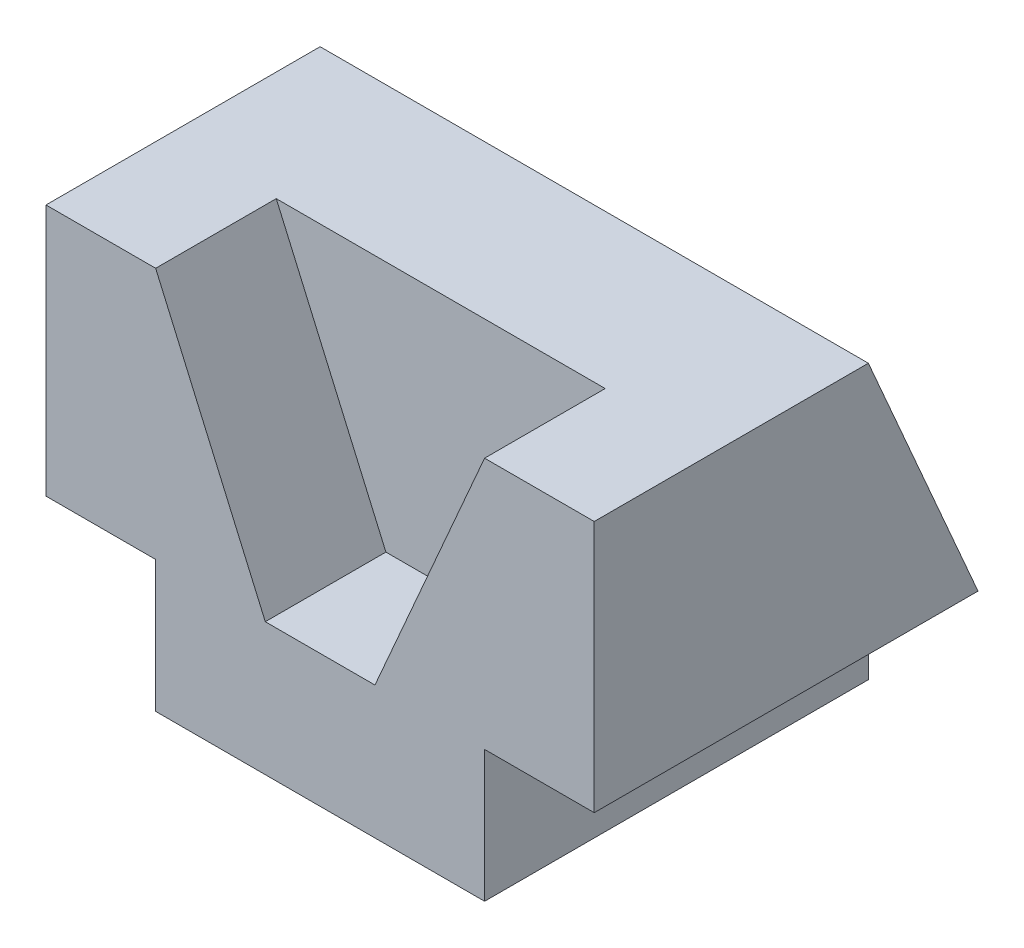
ISO-10303-21;
HEADER;
FILE_DESCRIPTION(('STEP AP214'),'2;1');
FILE_NAME('part.step','',(''),(''),'','','');
FILE_SCHEMA(('AUTOMOTIVE_DESIGN { 1 0 10303 214 1 1 1 1 }'));
ENDSEC;
DATA;
#1=APPLICATION_CONTEXT('core data for automotive mechanical design processes');
#2=APPLICATION_PROTOCOL_DEFINITION('international standard','automotive_design',2000,#1);
#3=PRODUCT_CONTEXT('',#1,'mechanical');
#4=PRODUCT('Part','Part','',(#3));
#5=PRODUCT_RELATED_PRODUCT_CATEGORY('part','',(#4));
#6=PRODUCT_DEFINITION_FORMATION('','',#4);
#7=PRODUCT_DEFINITION_CONTEXT('part definition',#1,'design');
#8=PRODUCT_DEFINITION('design','',#6,#7);
#9=PRODUCT_DEFINITION_SHAPE('','',#8);
#10=(LENGTH_UNIT() NAMED_UNIT(*) SI_UNIT(.MILLI.,.METRE.));
#11=(NAMED_UNIT(*) PLANE_ANGLE_UNIT() SI_UNIT($,.RADIAN.));
#12=(NAMED_UNIT(*) SI_UNIT($,.STERADIAN.) SOLID_ANGLE_UNIT());
#13=UNCERTAINTY_MEASURE_WITH_UNIT(LENGTH_MEASURE(1.E-05),#10,'distance_accuracy_value','');
#14=(GEOMETRIC_REPRESENTATION_CONTEXT(3) GLOBAL_UNCERTAINTY_ASSIGNED_CONTEXT((#13)) GLOBAL_UNIT_ASSIGNED_CONTEXT((#10,
#11,#12)) REPRESENTATION_CONTEXT('',''));
#15=CARTESIAN_POINT('',(0.,0.,0.));
#16=DIRECTION('',(0.,0.,1.));
#17=DIRECTION('',(1.,0.,0.));
#18=AXIS2_PLACEMENT_3D('',#15,#16,#17);
#19=CARTESIAN_POINT('',(-15000.,12000.,35000.));
#20=DIRECTION('',(1.,0.,0.));
#21=DIRECTION('',(0.,1.,0.));
#22=AXIS2_PLACEMENT_3D('',#19,#20,#21);
#23=PLANE('',#22);
#24=DIRECTION('',(0.,-1.,0.));
#25=VECTOR('',#24,1.);
#26=CARTESIAN_POINT('',(-15000.,12000.,0.));
#27=LINE('',#26,#25);
#28=CARTESIAN_POINT('',(-15000.,12000.,0.));
#29=VERTEX_POINT('',#28);
#30=CARTESIAN_POINT('',(-15000.,0.,0.));
#31=VERTEX_POINT('',#30);
#32=EDGE_CURVE('E133',#29,#31,#27,.T.);
#33=ORIENTED_EDGE('',*,*,#32,.T.);
#34=DIRECTION('',(0.,0.,-1.));
#35=VECTOR('',#34,1.);
#36=CARTESIAN_POINT('',(-15000.,0.,35000.));
#37=LINE('',#36,#35);
#38=CARTESIAN_POINT('',(-15000.,0.,35000.));
#39=VERTEX_POINT('',#38);
#40=EDGE_CURVE('E40',#39,#31,#37,.T.);
#41=ORIENTED_EDGE('',*,*,#40,.F.);
#42=DIRECTION('',(0.,-1.,0.));
#43=VECTOR('',#42,1.);
#44=CARTESIAN_POINT('',(-15000.,12000.,35000.));
#45=LINE('',#44,#43);
#46=CARTESIAN_POINT('',(-15000.,12000.,35000.));
#47=VERTEX_POINT('',#46);
#48=EDGE_CURVE('E147',#47,#39,#45,.T.);
#49=ORIENTED_EDGE('',*,*,#48,.F.);
#50=DIRECTION('',(0.,0.,-1.));
#51=VECTOR('',#50,1.);
#52=CARTESIAN_POINT('',(-15000.,12000.,35000.));
#53=LINE('',#52,#51);
#54=EDGE_CURVE('E128',#47,#29,#53,.T.);
#55=ORIENTED_EDGE('',*,*,#54,.T.);
#56=EDGE_LOOP('',(#33,#41,#49,#55));
#57=FACE_BOUND('',#56,.T.);
#58=ADVANCED_FACE('F33',(#57),#23,.F.);
#59=CARTESIAN_POINT('',(-15000.,0.,35000.));
#60=DIRECTION('',(0.,1.,0.));
#61=DIRECTION('',(-1.,0.,0.));
#62=AXIS2_PLACEMENT_3D('',#59,#60,#61);
#63=PLANE('',#62);
#64=DIRECTION('',(1.,0.,0.));
#65=VECTOR('',#64,1.);
#66=CARTESIAN_POINT('',(-15000.,0.,0.));
#67=LINE('',#66,#65);
#68=CARTESIAN_POINT('',(15000.,9.18485099360515E-12,0.));
#69=VERTEX_POINT('',#68);
#70=EDGE_CURVE('E136',#31,#69,#67,.T.);
#71=ORIENTED_EDGE('',*,*,#70,.T.);
#72=DIRECTION('',(0.,0.,-1.));
#73=VECTOR('',#72,1.);
#74=CARTESIAN_POINT('',(15000.,9.18485099360515E-12,35000.));
#75=LINE('',#74,#73);
#76=CARTESIAN_POINT('',(15000.,9.18485099360515E-12,35000.));
#77=VERTEX_POINT('',#76);
#78=EDGE_CURVE('E158',#77,#69,#75,.T.);
#79=ORIENTED_EDGE('',*,*,#78,.F.);
#80=DIRECTION('',(1.,0.,0.));
#81=VECTOR('',#80,1.);
#82=CARTESIAN_POINT('',(-15000.,0.,35000.));
#83=LINE('',#82,#81);
#84=EDGE_CURVE('E84',#39,#77,#83,.T.);
#85=ORIENTED_EDGE('',*,*,#84,.F.);
#86=ORIENTED_EDGE('',*,*,#40,.T.);
#87=EDGE_LOOP('',(#71,#79,#85,#86));
#88=FACE_BOUND('',#87,.T.);
#89=ADVANCED_FACE('F161',(#88),#63,.F.);
#90=CARTESIAN_POINT('',(15000.,9.18485099360515E-12,35000.));
#91=DIRECTION('',(-1.,0.,0.));
#92=DIRECTION('',(0.,0.,1.));
#93=AXIS2_PLACEMENT_3D('',#90,#91,#92);
#94=PLANE('',#93);
#95=DIRECTION('',(0.,1.,0.));
#96=VECTOR('',#95,1.);
#97=CARTESIAN_POINT('',(15000.,9.18485099360515E-12,0.));
#98=LINE('',#97,#96);
#99=CARTESIAN_POINT('',(15000.,12000.,0.));
#100=VERTEX_POINT('',#99);
#101=EDGE_CURVE('E139',#69,#100,#98,.T.);
#102=ORIENTED_EDGE('',*,*,#101,.T.);
#103=DIRECTION('',(0.,0.,-1.));
#104=VECTOR('',#103,1.);
#105=CARTESIAN_POINT('',(15000.,12000.,35000.));
#106=LINE('',#105,#104);
#107=CARTESIAN_POINT('',(15000.,12000.,35000.));
#108=VERTEX_POINT('',#107);
#109=EDGE_CURVE('E155',#108,#100,#106,.T.);
#110=ORIENTED_EDGE('',*,*,#109,.F.);
#111=DIRECTION('',(0.,1.,0.));
#112=VECTOR('',#111,1.);
#113=CARTESIAN_POINT('',(15000.,9.18485099360515E-12,35000.));
#114=LINE('',#113,#112);
#115=EDGE_CURVE('E224',#77,#108,#114,.T.);
#116=ORIENTED_EDGE('',*,*,#115,.F.);
#117=ORIENTED_EDGE('',*,*,#78,.T.);
#118=EDGE_LOOP('',(#102,#110,#116,#117));
#119=FACE_BOUND('',#118,.T.);
#120=ADVANCED_FACE('F233',(#119),#94,.F.);
#121=CARTESIAN_POINT('',(15000.,12000.,35000.));
#122=DIRECTION('',(0.,1.,0.));
#123=DIRECTION('',(0.,0.,1.));
#124=AXIS2_PLACEMENT_3D('',#121,#122,#123);
#125=PLANE('',#124);
#126=DIRECTION('',(1.,0.,0.));
#127=VECTOR('',#126,1.);
#128=CARTESIAN_POINT('',(15000.,12000.,0.));
#129=LINE('',#128,#127);
#130=CARTESIAN_POINT('',(25000.,12000.,0.));
#131=VERTEX_POINT('',#130);
#132=EDGE_CURVE('E142',#100,#131,#129,.T.);
#133=ORIENTED_EDGE('',*,*,#132,.T.);
#134=DIRECTION('',(0.,0.,-1.));
#135=VECTOR('',#134,1.);
#136=CARTESIAN_POINT('',(25000.,12000.,35000.));
#137=LINE('',#136,#135);
#138=CARTESIAN_POINT('',(25000.,12000.,35000.));
#139=VERTEX_POINT('',#138);
#140=EDGE_CURVE('E152',#139,#131,#137,.T.);
#141=ORIENTED_EDGE('',*,*,#140,.F.);
#142=DIRECTION('',(1.,0.,0.));
#143=VECTOR('',#142,1.);
#144=CARTESIAN_POINT('',(15000.,12000.,35000.));
#145=LINE('',#144,#143);
#146=EDGE_CURVE('E210',#108,#139,#145,.T.);
#147=ORIENTED_EDGE('',*,*,#146,.F.);
#148=ORIENTED_EDGE('',*,*,#109,.T.);
#149=EDGE_LOOP('',(#133,#141,#147,#148));
#150=FACE_BOUND('',#149,.T.);
#151=ADVANCED_FACE('F235',(#150),#125,.F.);
#152=CARTESIAN_POINT('',(25000.,12000.,35000.));
#153=DIRECTION('',(-1.,0.,0.));
#154=DIRECTION('',(0.,-1.,0.));
#155=AXIS2_PLACEMENT_3D('',#152,#153,#154);
#156=PLANE('',#155);
#157=ORIENTED_EDGE('',*,*,#140,.T.);
#158=DIRECTION('',(0.,0.917070056253235,0.39872611141445));
#159=VECTOR('',#158,1.);
#160=CARTESIAN_POINT('',(25000.,1907.79014308427,-4387.9173290938));
#161=LINE('',#160,#159);
#162=CARTESIAN_POINT('',(25000.,35000.,10000.));
#163=VERTEX_POINT('',#162);
#164=EDGE_CURVE('E75',#131,#163,#161,.T.);
#165=ORIENTED_EDGE('',*,*,#164,.T.);
#166=DIRECTION('',(0.,0.,-1.));
#167=VECTOR('',#166,1.);
#168=CARTESIAN_POINT('',(25000.,35000.,35000.));
#169=LINE('',#168,#167);
#170=CARTESIAN_POINT('',(25000.,35000.,35000.));
#171=VERTEX_POINT('',#170);
#172=EDGE_CURVE('E122',#171,#163,#169,.T.);
#173=ORIENTED_EDGE('',*,*,#172,.F.);
#174=DIRECTION('',(0.,1.,0.));
#175=VECTOR('',#174,1.);
#176=CARTESIAN_POINT('',(25000.,12000.,35000.));
#177=LINE('',#176,#175);
#178=EDGE_CURVE('E111',#139,#171,#177,.T.);
#179=ORIENTED_EDGE('',*,*,#178,.F.);
#180=EDGE_LOOP('',(#157,#165,#173,#179));
#181=FACE_BOUND('',#180,.T.);
#182=ADVANCED_FACE('F213',(#181),#156,.F.);
#183=CARTESIAN_POINT('',(25000.,35000.,35000.));
#184=DIRECTION('',(0.,-1.,0.));
#185=DIRECTION('',(1.,0.,0.));
#186=AXIS2_PLACEMENT_3D('',#183,#184,#185);
#187=PLANE('',#186);
#188=ORIENTED_EDGE('',*,*,#172,.T.);
#189=DIRECTION('',(-1.,0.,0.));
#190=VECTOR('',#189,1.);
#191=CARTESIAN_POINT('',(25000.,35000.,10000.));
#192=LINE('',#191,#190);
#193=CARTESIAN_POINT('',(-25000.,35000.,10000.));
#194=VERTEX_POINT('',#193);
#195=EDGE_CURVE('E119',#163,#194,#192,.T.);
#196=ORIENTED_EDGE('',*,*,#195,.T.);
#197=DIRECTION('',(0.,0.,-1.));
#198=VECTOR('',#197,1.);
#199=CARTESIAN_POINT('',(-25000.,35000.,35000.));
#200=LINE('',#199,#198);
#201=CARTESIAN_POINT('',(-25000.,35000.,35000.));
#202=VERTEX_POINT('',#201);
#203=EDGE_CURVE('E115',#202,#194,#200,.T.);
#204=ORIENTED_EDGE('',*,*,#203,.F.);
#205=DIRECTION('',(-1.,0.,0.));
#206=VECTOR('',#205,1.);
#207=CARTESIAN_POINT('',(25000.,35000.,35000.));
#208=LINE('',#207,#206);
#209=CARTESIAN_POINT('',(-15000.,35000.,35000.));
#210=VERTEX_POINT('',#209);
#211=EDGE_CURVE('E100',#210,#202,#208,.T.);
#212=ORIENTED_EDGE('',*,*,#211,.F.);
#213=DIRECTION('',(0.,0.,1.));
#214=VECTOR('',#213,1.);
#215=CARTESIAN_POINT('',(-15000.,35000.,24000.));
#216=LINE('',#215,#214);
#217=CARTESIAN_POINT('',(-15000.,35000.,24000.));
#218=VERTEX_POINT('',#217);
#219=EDGE_CURVE('E47',#218,#210,#216,.T.);
#220=ORIENTED_EDGE('',*,*,#219,.F.);
#221=DIRECTION('',(-1.,0.,0.));
#222=VECTOR('',#221,1.);
#223=CARTESIAN_POINT('',(-15000.,35000.,24000.));
#224=LINE('',#223,#222);
#225=CARTESIAN_POINT('',(15000.,35000.,24000.));
#226=VERTEX_POINT('',#225);
#227=EDGE_CURVE('E200',#226,#218,#224,.T.);
#228=ORIENTED_EDGE('',*,*,#227,.F.);
#229=DIRECTION('',(0.,0.,1.));
#230=VECTOR('',#229,1.);
#231=CARTESIAN_POINT('',(15000.,35000.,24000.));
#232=LINE('',#231,#230);
#233=CARTESIAN_POINT('',(15000.,35000.,35000.));
#234=VERTEX_POINT('',#233);
#235=EDGE_CURVE('E137',#226,#234,#232,.T.);
#236=ORIENTED_EDGE('',*,*,#235,.T.);
#237=EDGE_CURVE('E110',#171,#234,#208,.T.);
#238=ORIENTED_EDGE('',*,*,#237,.F.);
#239=EDGE_LOOP('',(#188,#196,#204,#212,#220,#228,#236,#238));
#240=FACE_BOUND('',#239,.T.);
#241=ADVANCED_FACE('F117',(#240),#187,.F.);
#242=CARTESIAN_POINT('',(-25000.,35000.,35000.));
#243=DIRECTION('',(1.,0.,0.));
#244=DIRECTION('',(0.,1.,0.));
#245=AXIS2_PLACEMENT_3D('',#242,#243,#244);
#246=PLANE('',#245);
#247=ORIENTED_EDGE('',*,*,#203,.T.);
#248=DIRECTION('',(0.,0.917070056253235,0.39872611141445));
#249=VECTOR('',#248,1.);
#250=CARTESIAN_POINT('',(-25000.,1907.79014308426,-4387.9173290938));
#251=LINE('',#250,#249);
#252=CARTESIAN_POINT('',(-25000.,12000.,0.));
#253=VERTEX_POINT('',#252);
#254=EDGE_CURVE('E219',#253,#194,#251,.T.);
#255=ORIENTED_EDGE('',*,*,#254,.F.);
#256=DIRECTION('',(0.,0.,-1.));
#257=VECTOR('',#256,1.);
#258=CARTESIAN_POINT('',(-25000.,12000.,35000.));
#259=LINE('',#258,#257);
#260=CARTESIAN_POINT('',(-25000.,12000.,35000.));
#261=VERTEX_POINT('',#260);
#262=EDGE_CURVE('E123',#261,#253,#259,.T.);
#263=ORIENTED_EDGE('',*,*,#262,.F.);
#264=DIRECTION('',(0.,-1.,0.));
#265=VECTOR('',#264,1.);
#266=CARTESIAN_POINT('',(-25000.,35000.,35000.));
#267=LINE('',#266,#265);
#268=EDGE_CURVE('E105',#202,#261,#267,.T.);
#269=ORIENTED_EDGE('',*,*,#268,.F.);
#270=EDGE_LOOP('',(#247,#255,#263,#269));
#271=FACE_BOUND('',#270,.T.);
#272=ADVANCED_FACE('F125',(#271),#246,.F.);
#273=CARTESIAN_POINT('',(-25000.,12000.,35000.));
#274=DIRECTION('',(0.,1.,0.));
#275=DIRECTION('',(0.,0.,1.));
#276=AXIS2_PLACEMENT_3D('',#273,#274,#275);
#277=PLANE('',#276);
#278=DIRECTION('',(1.,0.,0.));
#279=VECTOR('',#278,1.);
#280=CARTESIAN_POINT('',(-25000.,12000.,0.));
#281=LINE('',#280,#279);
#282=EDGE_CURVE('E144',#253,#29,#281,.T.);
#283=ORIENTED_EDGE('',*,*,#282,.T.);
#284=ORIENTED_EDGE('',*,*,#54,.F.);
#285=DIRECTION('',(1.,0.,0.));
#286=VECTOR('',#285,1.);
#287=CARTESIAN_POINT('',(-25000.,12000.,35000.));
#288=LINE('',#287,#286);
#289=EDGE_CURVE('E56',#261,#47,#288,.T.);
#290=ORIENTED_EDGE('',*,*,#289,.F.);
#291=ORIENTED_EDGE('',*,*,#262,.T.);
#292=EDGE_LOOP('',(#283,#284,#290,#291));
#293=FACE_BOUND('',#292,.T.);
#294=ADVANCED_FACE('F222',(#293),#277,.F.);
#295=CARTESIAN_POINT('',(0.,0.,35000.));
#296=DIRECTION('',(0.,0.,1.));
#297=DIRECTION('',(1.,0.,0.));
#298=AXIS2_PLACEMENT_3D('',#295,#296,#297);
#299=PLANE('',#298);
#300=DIRECTION('',(0.399926103828297,0.916547386378205,0.));
#301=VECTOR('',#300,1.);
#302=CARTESIAN_POINT('',(15000.,35000.,35000.));
#303=LINE('',#302,#301);
#304=CARTESIAN_POINT('',(5000.,12082.0814744388,35000.));
#305=VERTEX_POINT('',#304);
#306=EDGE_CURVE('E196',#305,#234,#303,.T.);
#307=ORIENTED_EDGE('',*,*,#306,.F.);
#308=DIRECTION('',(1.,0.,0.));
#309=VECTOR('',#308,1.);
#310=CARTESIAN_POINT('',(5000.,12082.0814744388,35000.));
#311=LINE('',#310,#309);
#312=CARTESIAN_POINT('',(-5000.,12082.0814744388,35000.));
#313=VERTEX_POINT('',#312);
#314=EDGE_CURVE('E201',#313,#305,#311,.T.);
#315=ORIENTED_EDGE('',*,*,#314,.F.);
#316=DIRECTION('',(0.399926103828297,-0.916547386378205,0.));
#317=VECTOR('',#316,1.);
#318=CARTESIAN_POINT('',(-5000.,12082.0814744388,35000.));
#319=LINE('',#318,#317);
#320=EDGE_CURVE('E108',#210,#313,#319,.T.);
#321=ORIENTED_EDGE('',*,*,#320,.F.);
#322=ORIENTED_EDGE('',*,*,#211,.T.);
#323=ORIENTED_EDGE('',*,*,#268,.T.);
#324=ORIENTED_EDGE('',*,*,#289,.T.);
#325=ORIENTED_EDGE('',*,*,#48,.T.);
#326=ORIENTED_EDGE('',*,*,#84,.T.);
#327=ORIENTED_EDGE('',*,*,#115,.T.);
#328=ORIENTED_EDGE('',*,*,#146,.T.);
#329=ORIENTED_EDGE('',*,*,#178,.T.);
#330=ORIENTED_EDGE('',*,*,#237,.T.);
#331=EDGE_LOOP('',(#307,#315,#321,#322,#323,#324,#325,#326,#327,#328,#329,#330));
#332=FACE_BOUND('',#331,.T.);
#333=ADVANCED_FACE('F103',(#332),#299,.T.);
#334=CARTESIAN_POINT('',(0.,0.,0.));
#335=DIRECTION('',(0.,0.,1.));
#336=DIRECTION('',(1.,0.,0.));
#337=AXIS2_PLACEMENT_3D('',#334,#335,#336);
#338=PLANE('',#337);
#339=ORIENTED_EDGE('',*,*,#32,.F.);
#340=DIRECTION('',(1.,0.,0.));
#341=VECTOR('',#340,1.);
#342=CARTESIAN_POINT('',(-1.85358974546113E-12,12000.,0.));
#343=LINE('',#342,#341);
#344=EDGE_CURVE('E11',#29,#100,#343,.T.);
#345=ORIENTED_EDGE('',*,*,#344,.T.);
#346=ORIENTED_EDGE('',*,*,#101,.F.);
#347=ORIENTED_EDGE('',*,*,#70,.F.);
#348=EDGE_LOOP('',(#339,#345,#346,#347));
#349=FACE_BOUND('',#348,.T.);
#350=ADVANCED_FACE('F167',(#349),#338,.F.);
#351=CARTESIAN_POINT('',(15000.,35000.,24000.));
#352=DIRECTION('',(0.916547386378205,-0.399926103828297,0.));
#353=DIRECTION('',(0.399926103828297,0.916547386378205,0.));
#354=AXIS2_PLACEMENT_3D('',#351,#352,#353);
#355=PLANE('',#354);
#356=ORIENTED_EDGE('',*,*,#306,.T.);
#357=ORIENTED_EDGE('',*,*,#235,.F.);
#358=DIRECTION('',(0.399926103828297,0.916547386378205,0.));
#359=VECTOR('',#358,1.);
#360=CARTESIAN_POINT('',(15000.,35000.,24000.));
#361=LINE('',#360,#359);
#362=CARTESIAN_POINT('',(5000.,12082.0814744388,24000.));
#363=VERTEX_POINT('',#362);
#364=EDGE_CURVE('E362',#363,#226,#361,.T.);
#365=ORIENTED_EDGE('',*,*,#364,.F.);
#366=DIRECTION('',(0.,0.,1.));
#367=VECTOR('',#366,1.);
#368=CARTESIAN_POINT('',(5000.,12082.0814744388,24000.));
#369=LINE('',#368,#367);
#370=EDGE_CURVE('E194',#363,#305,#369,.T.);
#371=ORIENTED_EDGE('',*,*,#370,.T.);
#372=EDGE_LOOP('',(#356,#357,#365,#371));
#373=FACE_BOUND('',#372,.T.);
#374=ADVANCED_FACE('F198',(#373),#355,.F.);
#375=CARTESIAN_POINT('',(5000.,12082.0814744388,24000.));
#376=DIRECTION('',(0.,-1.,0.));
#377=DIRECTION('',(0.,0.,-1.));
#378=AXIS2_PLACEMENT_3D('',#375,#376,#377);
#379=PLANE('',#378);
#380=ORIENTED_EDGE('',*,*,#314,.T.);
#381=ORIENTED_EDGE('',*,*,#370,.F.);
#382=DIRECTION('',(1.,0.,0.));
#383=VECTOR('',#382,1.);
#384=CARTESIAN_POINT('',(5000.,12082.0814744388,24000.));
#385=LINE('',#384,#383);
#386=CARTESIAN_POINT('',(-5000.,12082.0814744388,24000.));
#387=VERTEX_POINT('',#386);
#388=EDGE_CURVE('E363',#387,#363,#385,.T.);
#389=ORIENTED_EDGE('',*,*,#388,.F.);
#390=DIRECTION('',(0.,0.,1.));
#391=VECTOR('',#390,1.);
#392=CARTESIAN_POINT('',(-5000.,12082.0814744388,24000.));
#393=LINE('',#392,#391);
#394=EDGE_CURVE('E357',#387,#313,#393,.T.);
#395=ORIENTED_EDGE('',*,*,#394,.T.);
#396=EDGE_LOOP('',(#380,#381,#389,#395));
#397=FACE_BOUND('',#396,.T.);
#398=ADVANCED_FACE('F328',(#397),#379,.F.);
#399=CARTESIAN_POINT('',(-5000.,12082.0814744388,24000.));
#400=DIRECTION('',(-0.916547386378205,-0.399926103828297,0.));
#401=DIRECTION('',(0.399926103828297,-0.916547386378205,0.));
#402=AXIS2_PLACEMENT_3D('',#399,#400,#401);
#403=PLANE('',#402);
#404=ORIENTED_EDGE('',*,*,#320,.T.);
#405=ORIENTED_EDGE('',*,*,#394,.F.);
#406=DIRECTION('',(0.399926103828297,-0.916547386378205,0.));
#407=VECTOR('',#406,1.);
#408=CARTESIAN_POINT('',(-5000.,12082.0814744388,24000.));
#409=LINE('',#408,#407);
#410=EDGE_CURVE('E364',#218,#387,#409,.T.);
#411=ORIENTED_EDGE('',*,*,#410,.F.);
#412=ORIENTED_EDGE('',*,*,#219,.T.);
#413=EDGE_LOOP('',(#404,#405,#411,#412));
#414=FACE_BOUND('',#413,.T.);
#415=ADVANCED_FACE('F321',(#414),#403,.F.);
#416=CARTESIAN_POINT('',(0.,0.,24000.));
#417=DIRECTION('',(0.,0.,-1.));
#418=DIRECTION('',(-1.,0.,0.));
#419=AXIS2_PLACEMENT_3D('',#416,#417,#418);
#420=PLANE('',#419);
#421=ORIENTED_EDGE('',*,*,#227,.T.);
#422=ORIENTED_EDGE('',*,*,#410,.T.);
#423=ORIENTED_EDGE('',*,*,#388,.T.);
#424=ORIENTED_EDGE('',*,*,#364,.T.);
#425=EDGE_LOOP('',(#421,#422,#423,#424));
#426=FACE_BOUND('',#425,.T.);
#427=ADVANCED_FACE('F312',(#426),#420,.F.);
#428=CARTESIAN_POINT('',(25000.,1907.79014308427,-4387.9173290938));
#429=DIRECTION('',(0.,-0.39872611141445,0.917070056253235));
#430=DIRECTION('',(0.,-0.917070056253235,-0.39872611141445));
#431=AXIS2_PLACEMENT_3D('',#428,#429,#430);
#432=PLANE('',#431);
#433=ORIENTED_EDGE('',*,*,#254,.T.);
#434=ORIENTED_EDGE('',*,*,#195,.F.);
#435=ORIENTED_EDGE('',*,*,#164,.F.);
#436=ORIENTED_EDGE('',*,*,#132,.F.);
#437=ORIENTED_EDGE('',*,*,#344,.F.);
#438=ORIENTED_EDGE('',*,*,#282,.F.);
#439=EDGE_LOOP('',(#433,#434,#435,#436,#437,#438));
#440=FACE_BOUND('',#439,.T.);
#441=ADVANCED_FACE('F218',(#440),#432,.F.);
#442=CLOSED_SHELL('',(#58,#89,#120,#151,#182,#241,#272,#294,#333,#350,#374,#398,#415,#427,#441));
#443=MANIFOLD_SOLID_BREP('B2',#442);
#444=ADVANCED_BREP_SHAPE_REPRESENTATION('',(#18,#443),#14);
#445=SHAPE_DEFINITION_REPRESENTATION(#9,#444);
ENDSEC;
END-ISO-10303-21;
